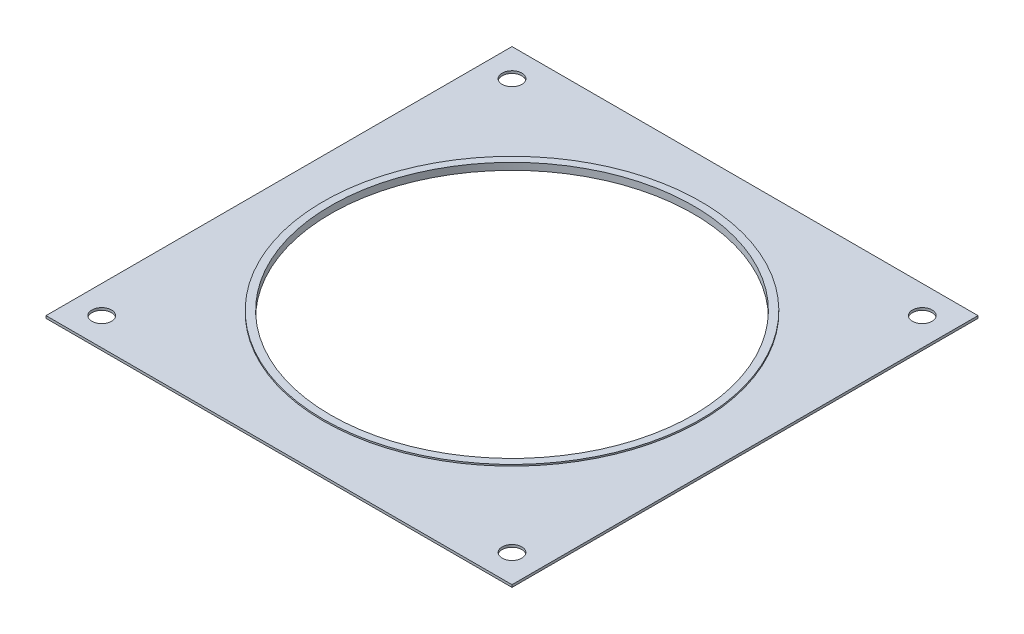
ISO-10303-21;
HEADER;
FILE_DESCRIPTION(('STEP AP214'),'2;1');
FILE_NAME('part.step','',(''),(''),'','','');
FILE_SCHEMA(('AUTOMOTIVE_DESIGN { 1 0 10303 214 1 1 1 1 }'));
ENDSEC;
DATA;
#1=APPLICATION_CONTEXT('core data for automotive mechanical design processes');
#2=APPLICATION_PROTOCOL_DEFINITION('international standard','automotive_design',2000,#1);
#3=PRODUCT_CONTEXT('',#1,'mechanical');
#4=PRODUCT('Part','Part','',(#3));
#5=PRODUCT_RELATED_PRODUCT_CATEGORY('part','',(#4));
#6=PRODUCT_DEFINITION_FORMATION('','',#4);
#7=PRODUCT_DEFINITION_CONTEXT('part definition',#1,'design');
#8=PRODUCT_DEFINITION('design','',#6,#7);
#9=PRODUCT_DEFINITION_SHAPE('','',#8);
#10=(LENGTH_UNIT() NAMED_UNIT(*) SI_UNIT(.MILLI.,.METRE.));
#11=(NAMED_UNIT(*) PLANE_ANGLE_UNIT() SI_UNIT($,.RADIAN.));
#12=(NAMED_UNIT(*) SI_UNIT($,.STERADIAN.) SOLID_ANGLE_UNIT());
#13=UNCERTAINTY_MEASURE_WITH_UNIT(LENGTH_MEASURE(1.E-05),#10,'distance_accuracy_value','');
#14=(GEOMETRIC_REPRESENTATION_CONTEXT(3) GLOBAL_UNCERTAINTY_ASSIGNED_CONTEXT((#13)) GLOBAL_UNIT_ASSIGNED_CONTEXT((#10,
#11,#12)) REPRESENTATION_CONTEXT('',''));
#15=CARTESIAN_POINT('',(0.,0.,0.));
#16=DIRECTION('',(0.,0.,1.));
#17=DIRECTION('',(1.,0.,0.));
#18=AXIS2_PLACEMENT_3D('',#15,#16,#17);
#19=CARTESIAN_POINT('',(0.,0.8,0.));
#20=DIRECTION('',(0.,-1.,0.));
#21=DIRECTION('',(0.,0.,-1.));
#22=AXIS2_PLACEMENT_3D('',#19,#20,#21);
#23=PLANE('',#22);
#24=CARTESIAN_POINT('',(67.8822509939086,0.8,67.8822509939086));
#25=DIRECTION('',(0.,1.,0.));
#26=DIRECTION('',(0.,0.,1.));
#27=AXIS2_PLACEMENT_3D('',#24,#25,#26);
#28=CIRCLE('',#27,3.25000000000001);
#29=CARTESIAN_POINT('',(67.8822509939086,0.8,71.1322509939086));
#30=VERTEX_POINT('',#29);
#31=EDGE_CURVE('E142',#30,#30,#28,.T.);
#32=ORIENTED_EDGE('',*,*,#31,.F.);
#33=EDGE_LOOP('',(#32));
#34=FACE_BOUND('',#33,.T.);
#35=CARTESIAN_POINT('',(-67.8822509939086,0.8,-67.8822509939086));
#36=DIRECTION('',(0.,1.,0.));
#37=DIRECTION('',(0.,0.,1.));
#38=AXIS2_PLACEMENT_3D('',#35,#36,#37);
#39=CIRCLE('',#38,3.25000000000001);
#40=CARTESIAN_POINT('',(-67.8822509939086,0.8,-64.6322509939086));
#41=VERTEX_POINT('',#40);
#42=EDGE_CURVE('E133',#41,#41,#39,.T.);
#43=ORIENTED_EDGE('',*,*,#42,.F.);
#44=EDGE_LOOP('',(#43));
#45=FACE_BOUND('',#44,.T.);
#46=DIRECTION('',(0.,0.,-1.));
#47=VECTOR('',#46,1.);
#48=CARTESIAN_POINT('',(77.1,0.8,77.1));
#49=LINE('',#48,#47);
#50=CARTESIAN_POINT('',(77.1,0.8,77.1));
#51=VERTEX_POINT('',#50);
#52=CARTESIAN_POINT('',(77.1,0.8,-77.1));
#53=VERTEX_POINT('',#52);
#54=EDGE_CURVE('E95',#51,#53,#49,.T.);
#55=ORIENTED_EDGE('',*,*,#54,.T.);
#56=DIRECTION('',(-1.,0.,0.));
#57=VECTOR('',#56,1.);
#58=CARTESIAN_POINT('',(-77.1,0.8,-77.1));
#59=LINE('',#58,#57);
#60=CARTESIAN_POINT('',(-77.1,0.8,-77.1));
#61=VERTEX_POINT('',#60);
#62=EDGE_CURVE('E90',#53,#61,#59,.T.);
#63=ORIENTED_EDGE('',*,*,#62,.T.);
#64=DIRECTION('',(0.,0.,1.));
#65=VECTOR('',#64,1.);
#66=CARTESIAN_POINT('',(-77.1,0.8,77.1));
#67=LINE('',#66,#65);
#68=CARTESIAN_POINT('',(-77.1,0.8,77.1));
#69=VERTEX_POINT('',#68);
#70=EDGE_CURVE('E93',#61,#69,#67,.T.);
#71=ORIENTED_EDGE('',*,*,#70,.T.);
#72=DIRECTION('',(1.,0.,0.));
#73=VECTOR('',#72,1.);
#74=CARTESIAN_POINT('',(-77.1,0.8,77.1));
#75=LINE('',#74,#73);
#76=EDGE_CURVE('E59',#69,#51,#75,.T.);
#77=ORIENTED_EDGE('',*,*,#76,.T.);
#78=EDGE_LOOP('',(#55,#63,#71,#77));
#79=FACE_BOUND('',#78,.T.);
#80=CARTESIAN_POINT('',(0.,0.8,0.));
#81=DIRECTION('',(0.,-1.,0.));
#82=DIRECTION('',(0.,0.,-1.));
#83=AXIS2_PLACEMENT_3D('',#80,#81,#82);
#84=CIRCLE('',#83,60.9958105872839);
#85=CARTESIAN_POINT('',(0.,0.8,-60.9958105872839));
#86=VERTEX_POINT('',#85);
#87=EDGE_CURVE('E11',#86,#86,#84,.F.);
#88=ORIENTED_EDGE('',*,*,#87,.F.);
#89=EDGE_LOOP('',(#88));
#90=FACE_BOUND('',#89,.T.);
#91=CARTESIAN_POINT('',(-67.8822509939086,0.8,67.8822509939086));
#92=DIRECTION('',(0.,-1.,0.));
#93=DIRECTION('',(0.,0.,-1.));
#94=AXIS2_PLACEMENT_3D('',#91,#92,#93);
#95=CIRCLE('',#94,3.25000000000001);
#96=CARTESIAN_POINT('',(-67.8822509939086,0.8,64.6322509939086));
#97=VERTEX_POINT('',#96);
#98=EDGE_CURVE('E130',#97,#97,#95,.T.);
#99=ORIENTED_EDGE('',*,*,#98,.T.);
#100=EDGE_LOOP('',(#99));
#101=FACE_BOUND('',#100,.T.);
#102=CARTESIAN_POINT('',(67.8822509939086,0.8,-67.8822509939086));
#103=DIRECTION('',(0.,-1.,0.));
#104=DIRECTION('',(0.,0.,-1.));
#105=AXIS2_PLACEMENT_3D('',#102,#103,#104);
#106=CIRCLE('',#105,3.25000000000001);
#107=CARTESIAN_POINT('',(67.8822509939086,0.8,-71.1322509939086));
#108=VERTEX_POINT('',#107);
#109=EDGE_CURVE('E129',#108,#108,#106,.T.);
#110=ORIENTED_EDGE('',*,*,#109,.T.);
#111=EDGE_LOOP('',(#110));
#112=FACE_BOUND('',#111,.T.);
#113=ADVANCED_FACE('F42',(#34,#45,#79,#90,#101,#112),#23,.F.);
#114=CARTESIAN_POINT('',(0.,0.,0.));
#115=DIRECTION('',(0.,-1.,0.));
#116=DIRECTION('',(0.,0.,-1.));
#117=AXIS2_PLACEMENT_3D('',#114,#115,#116);
#118=PLANE('',#117);
#119=CARTESIAN_POINT('',(-67.8822509939086,0.,67.8822509939086));
#120=DIRECTION('',(0.,-1.,0.));
#121=DIRECTION('',(0.,0.,-1.));
#122=AXIS2_PLACEMENT_3D('',#119,#120,#121);
#123=CIRCLE('',#122,3.25000000000001);
#124=CARTESIAN_POINT('',(-67.8822509939086,0.,64.6322509939086));
#125=VERTEX_POINT('',#124);
#126=EDGE_CURVE('E136',#125,#125,#123,.T.);
#127=ORIENTED_EDGE('',*,*,#126,.F.);
#128=EDGE_LOOP('',(#127));
#129=FACE_BOUND('',#128,.T.);
#130=CARTESIAN_POINT('',(67.8822509939086,0.,67.8822509939086));
#131=DIRECTION('',(0.,1.,0.));
#132=DIRECTION('',(0.,0.,1.));
#133=AXIS2_PLACEMENT_3D('',#130,#131,#132);
#134=CIRCLE('',#133,3.25000000000001);
#135=CARTESIAN_POINT('',(67.8822509939086,0.,71.1322509939086));
#136=VERTEX_POINT('',#135);
#137=EDGE_CURVE('E354',#136,#136,#134,.T.);
#138=ORIENTED_EDGE('',*,*,#137,.T.);
#139=EDGE_LOOP('',(#138));
#140=FACE_BOUND('',#139,.T.);
#141=CARTESIAN_POINT('',(-67.8822509939086,0.,-67.8822509939086));
#142=DIRECTION('',(0.,1.,0.));
#143=DIRECTION('',(0.,0.,1.));
#144=AXIS2_PLACEMENT_3D('',#141,#142,#143);
#145=CIRCLE('',#144,3.25000000000001);
#146=CARTESIAN_POINT('',(-67.8822509939086,0.,-64.6322509939086));
#147=VERTEX_POINT('',#146);
#148=EDGE_CURVE('E143',#147,#147,#145,.T.);
#149=ORIENTED_EDGE('',*,*,#148,.T.);
#150=EDGE_LOOP('',(#149));
#151=FACE_BOUND('',#150,.T.);
#152=CARTESIAN_POINT('',(0.,0.,0.));
#153=DIRECTION('',(0.,1.,0.));
#154=DIRECTION('',(0.,0.,1.));
#155=AXIS2_PLACEMENT_3D('',#152,#153,#154);
#156=CIRCLE('',#155,60.);
#157=CARTESIAN_POINT('',(0.,0.,60.));
#158=VERTEX_POINT('',#157);
#159=EDGE_CURVE('E112',#158,#158,#156,.T.);
#160=ORIENTED_EDGE('',*,*,#159,.T.);
#161=EDGE_LOOP('',(#160));
#162=FACE_BOUND('',#161,.T.);
#163=DIRECTION('',(0.,0.,-1.));
#164=VECTOR('',#163,1.);
#165=CARTESIAN_POINT('',(77.1,0.,77.1));
#166=LINE('',#165,#164);
#167=CARTESIAN_POINT('',(77.1,0.,77.1));
#168=VERTEX_POINT('',#167);
#169=CARTESIAN_POINT('',(77.1,0.,-77.1));
#170=VERTEX_POINT('',#169);
#171=EDGE_CURVE('E109',#168,#170,#166,.T.);
#172=ORIENTED_EDGE('',*,*,#171,.F.);
#173=DIRECTION('',(1.,0.,0.));
#174=VECTOR('',#173,1.);
#175=CARTESIAN_POINT('',(-77.1,0.,77.1));
#176=LINE('',#175,#174);
#177=CARTESIAN_POINT('',(-77.1,0.,77.1));
#178=VERTEX_POINT('',#177);
#179=EDGE_CURVE('E82',#178,#168,#176,.T.);
#180=ORIENTED_EDGE('',*,*,#179,.F.);
#181=DIRECTION('',(0.,0.,1.));
#182=VECTOR('',#181,1.);
#183=CARTESIAN_POINT('',(-77.1,0.,77.1));
#184=LINE('',#183,#182);
#185=CARTESIAN_POINT('',(-77.1,0.,-77.1));
#186=VERTEX_POINT('',#185);
#187=EDGE_CURVE('E76',#186,#178,#184,.T.);
#188=ORIENTED_EDGE('',*,*,#187,.F.);
#189=DIRECTION('',(-1.,0.,0.));
#190=VECTOR('',#189,1.);
#191=CARTESIAN_POINT('',(-77.1,0.,-77.1));
#192=LINE('',#191,#190);
#193=EDGE_CURVE('E100',#170,#186,#192,.T.);
#194=ORIENTED_EDGE('',*,*,#193,.F.);
#195=EDGE_LOOP('',(#172,#180,#188,#194));
#196=FACE_BOUND('',#195,.T.);
#197=CARTESIAN_POINT('',(67.8822509939086,0.,-67.8822509939086));
#198=DIRECTION('',(0.,-1.,0.));
#199=DIRECTION('',(0.,0.,-1.));
#200=AXIS2_PLACEMENT_3D('',#197,#198,#199);
#201=CIRCLE('',#200,3.25000000000001);
#202=CARTESIAN_POINT('',(67.8822509939086,0.,-71.1322509939086));
#203=VERTEX_POINT('',#202);
#204=EDGE_CURVE('E127',#203,#203,#201,.T.);
#205=ORIENTED_EDGE('',*,*,#204,.F.);
#206=EDGE_LOOP('',(#205));
#207=FACE_BOUND('',#206,.T.);
#208=ADVANCED_FACE('F120',(#129,#140,#151,#162,#196,#207),#118,.T.);
#209=CARTESIAN_POINT('',(77.1,0.8,77.1));
#210=DIRECTION('',(-1.,0.,0.));
#211=DIRECTION('',(0.,0.,1.));
#212=AXIS2_PLACEMENT_3D('',#209,#210,#211);
#213=PLANE('',#212);
#214=ORIENTED_EDGE('',*,*,#171,.T.);
#215=DIRECTION('',(0.,-1.,0.));
#216=VECTOR('',#215,1.);
#217=CARTESIAN_POINT('',(77.1,0.8,-77.1));
#218=LINE('',#217,#216);
#219=EDGE_CURVE('E51',#53,#170,#218,.T.);
#220=ORIENTED_EDGE('',*,*,#219,.F.);
#221=ORIENTED_EDGE('',*,*,#54,.F.);
#222=DIRECTION('',(0.,-1.,0.));
#223=VECTOR('',#222,1.);
#224=CARTESIAN_POINT('',(77.1,0.8,77.1));
#225=LINE('',#224,#223);
#226=EDGE_CURVE('E105',#51,#168,#225,.T.);
#227=ORIENTED_EDGE('',*,*,#226,.T.);
#228=EDGE_LOOP('',(#214,#220,#221,#227));
#229=FACE_BOUND('',#228,.T.);
#230=ADVANCED_FACE('F44',(#229),#213,.F.);
#231=CARTESIAN_POINT('',(-77.1,0.8,-77.1));
#232=DIRECTION('',(0.,0.,1.));
#233=DIRECTION('',(1.,0.,0.));
#234=AXIS2_PLACEMENT_3D('',#231,#232,#233);
#235=PLANE('',#234);
#236=ORIENTED_EDGE('',*,*,#193,.T.);
#237=DIRECTION('',(0.,-1.,0.));
#238=VECTOR('',#237,1.);
#239=CARTESIAN_POINT('',(-77.1,0.8,-77.1));
#240=LINE('',#239,#238);
#241=EDGE_CURVE('E98',#61,#186,#240,.T.);
#242=ORIENTED_EDGE('',*,*,#241,.F.);
#243=ORIENTED_EDGE('',*,*,#62,.F.);
#244=ORIENTED_EDGE('',*,*,#219,.T.);
#245=EDGE_LOOP('',(#236,#242,#243,#244));
#246=FACE_BOUND('',#245,.T.);
#247=ADVANCED_FACE('F99',(#246),#235,.F.);
#248=CARTESIAN_POINT('',(-77.1,0.8,77.1));
#249=DIRECTION('',(1.,0.,0.));
#250=DIRECTION('',(0.,0.,-1.));
#251=AXIS2_PLACEMENT_3D('',#248,#249,#250);
#252=PLANE('',#251);
#253=ORIENTED_EDGE('',*,*,#187,.T.);
#254=DIRECTION('',(0.,-1.,0.));
#255=VECTOR('',#254,1.);
#256=CARTESIAN_POINT('',(-77.1,0.8,77.1));
#257=LINE('',#256,#255);
#258=EDGE_CURVE('E101',#69,#178,#257,.T.);
#259=ORIENTED_EDGE('',*,*,#258,.F.);
#260=ORIENTED_EDGE('',*,*,#70,.F.);
#261=ORIENTED_EDGE('',*,*,#241,.T.);
#262=EDGE_LOOP('',(#253,#259,#260,#261));
#263=FACE_BOUND('',#262,.T.);
#264=ADVANCED_FACE('F103',(#263),#252,.F.);
#265=CARTESIAN_POINT('',(-77.1,0.8,77.1));
#266=DIRECTION('',(0.,0.,-1.));
#267=DIRECTION('',(-1.,0.,0.));
#268=AXIS2_PLACEMENT_3D('',#265,#266,#267);
#269=PLANE('',#268);
#270=ORIENTED_EDGE('',*,*,#179,.T.);
#271=ORIENTED_EDGE('',*,*,#226,.F.);
#272=ORIENTED_EDGE('',*,*,#76,.F.);
#273=ORIENTED_EDGE('',*,*,#258,.T.);
#274=EDGE_LOOP('',(#270,#271,#272,#273));
#275=FACE_BOUND('',#274,.T.);
#276=ADVANCED_FACE('F168',(#275),#269,.F.);
#277=CARTESIAN_POINT('',(0.,0.,0.));
#278=DIRECTION('',(0.,1.,0.));
#279=DIRECTION('',(0.,0.,1.));
#280=AXIS2_PLACEMENT_3D('',#277,#278,#279);
#281=CYLINDRICAL_SURFACE('',#280,60.);
#282=ORIENTED_EDGE('',*,*,#159,.F.);
#283=EDGE_LOOP('',(#282));
#284=FACE_BOUND('',#283,.T.);
#285=CARTESIAN_POINT('',(0.,2.3,0.));
#286=DIRECTION('',(0.,1.,0.));
#287=DIRECTION('',(0.,0.,1.));
#288=AXIS2_PLACEMENT_3D('',#285,#286,#287);
#289=CIRCLE('',#288,60.);
#290=CARTESIAN_POINT('',(0.,2.3,60.));
#291=VERTEX_POINT('',#290);
#292=EDGE_CURVE('E146',#291,#291,#289,.T.);
#293=ORIENTED_EDGE('',*,*,#292,.T.);
#294=EDGE_LOOP('',(#293));
#295=FACE_BOUND('',#294,.T.);
#296=ADVANCED_FACE('F164',(#284,#295),#281,.F.);
#297=CARTESIAN_POINT('',(0.,1.8,0.));
#298=DIRECTION('',(0.,-1.,0.));
#299=DIRECTION('',(0.,0.,-1.));
#300=AXIS2_PLACEMENT_3D('',#297,#298,#299);
#301=CYLINDRICAL_SURFACE('',#300,60.9958105872839);
#302=CARTESIAN_POINT('',(0.,1.8,0.));
#303=DIRECTION('',(0.,1.,0.));
#304=DIRECTION('',(0.,0.,1.));
#305=AXIS2_PLACEMENT_3D('',#302,#303,#304);
#306=CIRCLE('',#305,60.9958105872839);
#307=CARTESIAN_POINT('',(0.,1.8,60.9958105872839));
#308=VERTEX_POINT('',#307);
#309=EDGE_CURVE('E155',#308,#308,#306,.T.);
#310=ORIENTED_EDGE('',*,*,#309,.F.);
#311=EDGE_LOOP('',(#310));
#312=FACE_BOUND('',#311,.T.);
#313=ORIENTED_EDGE('',*,*,#87,.T.);
#314=EDGE_LOOP('',(#313));
#315=FACE_BOUND('',#314,.T.);
#316=ADVANCED_FACE('F167',(#312,#315),#301,.T.);
#317=CARTESIAN_POINT('',(0.,2.3,0.));
#318=DIRECTION('',(0.,1.,0.));
#319=DIRECTION('',(0.,0.,1.));
#320=AXIS2_PLACEMENT_3D('',#317,#318,#319);
#321=PLANE('',#320);
#322=CARTESIAN_POINT('',(0.,2.3,0.));
#323=DIRECTION('',(0.,1.,0.));
#324=DIRECTION('',(0.,0.,1.));
#325=AXIS2_PLACEMENT_3D('',#322,#323,#324);
#326=CIRCLE('',#325,62.4340192611235);
#327=CARTESIAN_POINT('',(0.,2.3,62.4340192611235));
#328=VERTEX_POINT('',#327);
#329=EDGE_CURVE('E152',#328,#328,#326,.T.);
#330=ORIENTED_EDGE('',*,*,#329,.T.);
#331=EDGE_LOOP('',(#330));
#332=FACE_BOUND('',#331,.T.);
#333=ORIENTED_EDGE('',*,*,#292,.F.);
#334=EDGE_LOOP('',(#333));
#335=FACE_BOUND('',#334,.T.);
#336=ADVANCED_FACE('F172',(#332,#335),#321,.T.);
#337=CARTESIAN_POINT('',(0.,1.8,0.));
#338=DIRECTION('',(0.,1.,0.));
#339=DIRECTION('',(0.,0.,1.));
#340=AXIS2_PLACEMENT_3D('',#337,#338,#339);
#341=PLANE('',#340);
#342=ORIENTED_EDGE('',*,*,#309,.T.);
#343=EDGE_LOOP('',(#342));
#344=FACE_BOUND('',#343,.T.);
#345=CARTESIAN_POINT('',(0.,1.8,0.));
#346=DIRECTION('',(0.,1.,0.));
#347=DIRECTION('',(0.,0.,1.));
#348=AXIS2_PLACEMENT_3D('',#345,#346,#347);
#349=CIRCLE('',#348,62.4340192611235);
#350=CARTESIAN_POINT('',(0.,1.8,62.4340192611235));
#351=VERTEX_POINT('',#350);
#352=EDGE_CURVE('E151',#351,#351,#349,.T.);
#353=ORIENTED_EDGE('',*,*,#352,.F.);
#354=EDGE_LOOP('',(#353));
#355=FACE_BOUND('',#354,.T.);
#356=ADVANCED_FACE('F174',(#344,#355),#341,.F.);
#357=CARTESIAN_POINT('',(0.,2.3,0.));
#358=DIRECTION('',(0.,-1.,0.));
#359=DIRECTION('',(0.,0.,-1.));
#360=AXIS2_PLACEMENT_3D('',#357,#358,#359);
#361=CYLINDRICAL_SURFACE('',#360,62.4340192611235);
#362=ORIENTED_EDGE('',*,*,#329,.F.);
#363=EDGE_LOOP('',(#362));
#364=FACE_BOUND('',#363,.T.);
#365=ORIENTED_EDGE('',*,*,#352,.T.);
#366=EDGE_LOOP('',(#365));
#367=FACE_BOUND('',#366,.T.);
#368=ADVANCED_FACE('F181',(#364,#367),#361,.T.);
#369=CARTESIAN_POINT('',(-67.8822509939086,0.,-67.8822509939086));
#370=DIRECTION('',(0.,1.,0.));
#371=DIRECTION('',(0.,0.,1.));
#372=AXIS2_PLACEMENT_3D('',#369,#370,#371);
#373=CYLINDRICAL_SURFACE('',#372,3.25000000000001);
#374=ORIENTED_EDGE('',*,*,#148,.F.);
#375=EDGE_LOOP('',(#374));
#376=FACE_BOUND('',#375,.T.);
#377=ORIENTED_EDGE('',*,*,#42,.T.);
#378=EDGE_LOOP('',(#377));
#379=FACE_BOUND('',#378,.T.);
#380=ADVANCED_FACE('F219',(#376,#379),#373,.F.);
#381=CARTESIAN_POINT('',(67.8822509939086,0.,67.8822509939086));
#382=DIRECTION('',(0.,1.,0.));
#383=DIRECTION('',(0.,0.,1.));
#384=AXIS2_PLACEMENT_3D('',#381,#382,#383);
#385=CYLINDRICAL_SURFACE('',#384,3.25000000000001);
#386=ORIENTED_EDGE('',*,*,#137,.F.);
#387=EDGE_LOOP('',(#386));
#388=FACE_BOUND('',#387,.T.);
#389=ORIENTED_EDGE('',*,*,#31,.T.);
#390=EDGE_LOOP('',(#389));
#391=FACE_BOUND('',#390,.T.);
#392=ADVANCED_FACE('F224',(#388,#391),#385,.F.);
#393=CARTESIAN_POINT('',(-67.8822509939086,0.,67.8822509939086));
#394=DIRECTION('',(0.,1.,0.));
#395=DIRECTION('',(0.,0.,1.));
#396=AXIS2_PLACEMENT_3D('',#393,#394,#395);
#397=CYLINDRICAL_SURFACE('',#396,3.25000000000001);
#398=ORIENTED_EDGE('',*,*,#126,.T.);
#399=EDGE_LOOP('',(#398));
#400=FACE_BOUND('',#399,.T.);
#401=ORIENTED_EDGE('',*,*,#98,.F.);
#402=EDGE_LOOP('',(#401));
#403=FACE_BOUND('',#402,.T.);
#404=ADVANCED_FACE('F235',(#400,#403),#397,.F.);
#405=CARTESIAN_POINT('',(67.8822509939086,0.,-67.8822509939086));
#406=DIRECTION('',(0.,1.,0.));
#407=DIRECTION('',(0.,0.,1.));
#408=AXIS2_PLACEMENT_3D('',#405,#406,#407);
#409=CYLINDRICAL_SURFACE('',#408,3.25000000000001);
#410=ORIENTED_EDGE('',*,*,#204,.T.);
#411=EDGE_LOOP('',(#410));
#412=FACE_BOUND('',#411,.T.);
#413=ORIENTED_EDGE('',*,*,#109,.F.);
#414=EDGE_LOOP('',(#413));
#415=FACE_BOUND('',#414,.T.);
#416=ADVANCED_FACE('F246',(#412,#415),#409,.F.);
#417=CLOSED_SHELL('',(#113,#208,#230,#247,#264,#276,#296,#316,#336,#356,#368,#380,#392,#404,#416));
#418=MANIFOLD_SOLID_BREP('B2',#417);
#419=ADVANCED_BREP_SHAPE_REPRESENTATION('',(#18,#418),#14);
#420=SHAPE_DEFINITION_REPRESENTATION(#9,#419);
ENDSEC;
END-ISO-10303-21;
